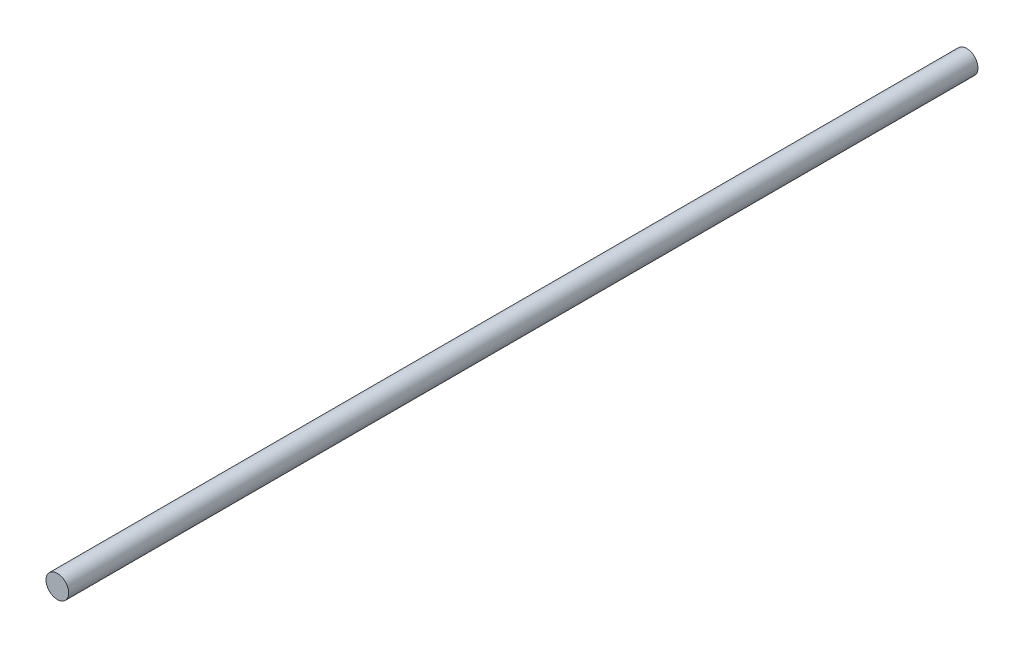
ISO-10303-21;
HEADER;
FILE_DESCRIPTION(('STEP AP214'),'2;1');
FILE_NAME('part.step','',(''),(''),'','','');
FILE_SCHEMA(('AUTOMOTIVE_DESIGN { 1 0 10303 214 1 1 1 1 }'));
ENDSEC;
DATA;
#1=APPLICATION_CONTEXT('core data for automotive mechanical design processes');
#2=APPLICATION_PROTOCOL_DEFINITION('international standard','automotive_design',2000,#1);
#3=PRODUCT_CONTEXT('',#1,'mechanical');
#4=PRODUCT('Part','Part','',(#3));
#5=PRODUCT_RELATED_PRODUCT_CATEGORY('part','',(#4));
#6=PRODUCT_DEFINITION_FORMATION('','',#4);
#7=PRODUCT_DEFINITION_CONTEXT('part definition',#1,'design');
#8=PRODUCT_DEFINITION('design','',#6,#7);
#9=PRODUCT_DEFINITION_SHAPE('','',#8);
#10=(LENGTH_UNIT() NAMED_UNIT(*) SI_UNIT(.MILLI.,.METRE.));
#11=(NAMED_UNIT(*) PLANE_ANGLE_UNIT() SI_UNIT($,.RADIAN.));
#12=(NAMED_UNIT(*) SI_UNIT($,.STERADIAN.) SOLID_ANGLE_UNIT());
#13=UNCERTAINTY_MEASURE_WITH_UNIT(LENGTH_MEASURE(1.E-05),#10,'distance_accuracy_value','');
#14=(GEOMETRIC_REPRESENTATION_CONTEXT(3) GLOBAL_UNCERTAINTY_ASSIGNED_CONTEXT((#13)) GLOBAL_UNIT_ASSIGNED_CONTEXT((#10,
#11,#12)) REPRESENTATION_CONTEXT('',''));
#15=CARTESIAN_POINT('',(0.,0.,0.));
#16=DIRECTION('',(0.,0.,1.));
#17=DIRECTION('',(1.,0.,0.));
#18=AXIS2_PLACEMENT_3D('',#15,#16,#17);
#19=CARTESIAN_POINT('',(0.,0.,500.));
#20=DIRECTION('',(0.,0.,-1.));
#21=DIRECTION('',(-1.,0.,0.));
#22=AXIS2_PLACEMENT_3D('',#19,#20,#21);
#23=CYLINDRICAL_SURFACE('',#22,12.5);
#24=CARTESIAN_POINT('',(0.,0.,500.));
#25=DIRECTION('',(0.,0.,1.));
#26=DIRECTION('',(1.,0.,0.));
#27=AXIS2_PLACEMENT_3D('',#24,#25,#26);
#28=CIRCLE('',#27,12.5);
#29=CARTESIAN_POINT('',(12.5,0.,500.));
#30=VERTEX_POINT('',#29);
#31=EDGE_CURVE('E10',#30,#30,#28,.T.);
#32=ORIENTED_EDGE('',*,*,#31,.F.);
#33=EDGE_LOOP('',(#32));
#34=FACE_BOUND('',#33,.T.);
#35=CARTESIAN_POINT('',(0.,0.,-500.));
#36=DIRECTION('',(0.,0.,1.));
#37=DIRECTION('',(1.,0.,0.));
#38=AXIS2_PLACEMENT_3D('',#35,#36,#37);
#39=CIRCLE('',#38,12.5);
#40=CARTESIAN_POINT('',(12.5,0.,-500.));
#41=VERTEX_POINT('',#40);
#42=EDGE_CURVE('E34',#41,#41,#39,.T.);
#43=ORIENTED_EDGE('',*,*,#42,.T.);
#44=EDGE_LOOP('',(#43));
#45=FACE_BOUND('',#44,.T.);
#46=ADVANCED_FACE('F31',(#34,#45),#23,.T.);
#47=CARTESIAN_POINT('',(0.,0.,500.));
#48=DIRECTION('',(0.,0.,1.));
#49=DIRECTION('',(1.,0.,0.));
#50=AXIS2_PLACEMENT_3D('',#47,#48,#49);
#51=PLANE('',#50);
#52=ORIENTED_EDGE('',*,*,#31,.T.);
#53=EDGE_LOOP('',(#52));
#54=FACE_BOUND('',#53,.T.);
#55=ADVANCED_FACE('F46',(#54),#51,.T.);
#56=CARTESIAN_POINT('',(0.,0.,-500.));
#57=DIRECTION('',(0.,0.,1.));
#58=DIRECTION('',(1.,0.,0.));
#59=AXIS2_PLACEMENT_3D('',#56,#57,#58);
#60=PLANE('',#59);
#61=ORIENTED_EDGE('',*,*,#42,.F.);
#62=EDGE_LOOP('',(#61));
#63=FACE_BOUND('',#62,.T.);
#64=ADVANCED_FACE('F44',(#63),#60,.F.);
#65=CLOSED_SHELL('',(#46,#55,#64));
#66=MANIFOLD_SOLID_BREP('B2',#65);
#67=ADVANCED_BREP_SHAPE_REPRESENTATION('',(#18,#66),#14);
#68=SHAPE_DEFINITION_REPRESENTATION(#9,#67);
ENDSEC;
END-ISO-10303-21;
